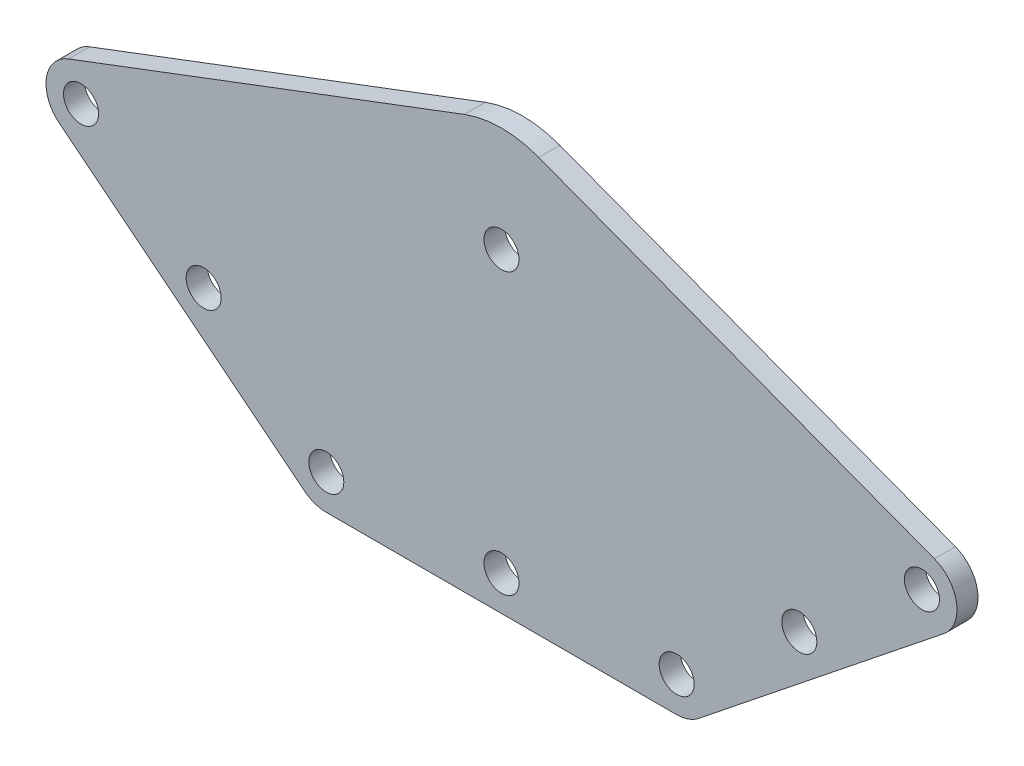
ISO-10303-21;
HEADER;
FILE_DESCRIPTION(('STEP AP214'),'2;1');
FILE_NAME('part.step','',(''),(''),'','','');
FILE_SCHEMA(('AUTOMOTIVE_DESIGN { 1 0 10303 214 1 1 1 1 }'));
ENDSEC;
DATA;
#1=APPLICATION_CONTEXT('core data for automotive mechanical design processes');
#2=APPLICATION_PROTOCOL_DEFINITION('international standard','automotive_design',2000,#1);
#3=PRODUCT_CONTEXT('',#1,'mechanical');
#4=PRODUCT('Part','Part','',(#3));
#5=PRODUCT_RELATED_PRODUCT_CATEGORY('part','',(#4));
#6=PRODUCT_DEFINITION_FORMATION('','',#4);
#7=PRODUCT_DEFINITION_CONTEXT('part definition',#1,'design');
#8=PRODUCT_DEFINITION('design','',#6,#7);
#9=PRODUCT_DEFINITION_SHAPE('','',#8);
#10=(LENGTH_UNIT() NAMED_UNIT(*) SI_UNIT(.MILLI.,.METRE.));
#11=(NAMED_UNIT(*) PLANE_ANGLE_UNIT() SI_UNIT($,.RADIAN.));
#12=(NAMED_UNIT(*) SI_UNIT($,.STERADIAN.) SOLID_ANGLE_UNIT());
#13=UNCERTAINTY_MEASURE_WITH_UNIT(LENGTH_MEASURE(1.E-05),#10,'distance_accuracy_value','');
#14=(GEOMETRIC_REPRESENTATION_CONTEXT(3) GLOBAL_UNCERTAINTY_ASSIGNED_CONTEXT((#13)) GLOBAL_UNIT_ASSIGNED_CONTEXT((#10,
#11,#12)) REPRESENTATION_CONTEXT('',''));
#15=CARTESIAN_POINT('',(0.,0.,0.));
#16=DIRECTION('',(0.,0.,1.));
#17=DIRECTION('',(1.,0.,0.));
#18=AXIS2_PLACEMENT_3D('',#15,#16,#17);
#19=CARTESIAN_POINT('',(-60.,27.9784594893,3.));
#20=DIRECTION('',(0.,0.,-1.));
#21=DIRECTION('',(-1.,0.,0.));
#22=AXIS2_PLACEMENT_3D('',#19,#20,#21);
#23=PLANE('',#22);
#24=CARTESIAN_POINT('',(-60.,27.9784594893,3.));
#25=DIRECTION('',(0.,0.,1.));
#26=DIRECTION('',(-1.,0.,0.));
#27=AXIS2_PLACEMENT_3D('',#24,#25,#26);
#28=CIRCLE('',#27,5.);
#29=CARTESIAN_POINT('',(-61.7702394037156,32.6545959772067,3.));
#30=VERTEX_POINT('',#29);
#31=CARTESIAN_POINT('',(-63.1220093937488,24.0729432180057,3.));
#32=VERTEX_POINT('',#31);
#33=EDGE_CURVE('E162',#30,#32,#28,.T.);
#34=ORIENTED_EDGE('',*,*,#33,.T.);
#35=DIRECTION('',(0.781103254258852,-0.624401878749762,0.));
#36=VECTOR('',#35,1.);
#37=CARTESIAN_POINT('',(-63.1220093937488,24.0729432180057,3.));
#38=LINE('',#37,#36);
#39=CARTESIAN_POINT('',(-28.1220093937488,-3.90551627129425,3.));
#40=VERTEX_POINT('',#39);
#41=EDGE_CURVE('E99',#32,#40,#38,.T.);
#42=ORIENTED_EDGE('',*,*,#41,.T.);
#43=CARTESIAN_POINT('',(-25.,0.,3.));
#44=DIRECTION('',(0.,0.,1.));
#45=DIRECTION('',(1.,0.,0.));
#46=AXIS2_PLACEMENT_3D('',#43,#44,#45);
#47=CIRCLE('',#46,5.00000000000001);
#48=CARTESIAN_POINT('',(-25.,-5.,3.));
#49=VERTEX_POINT('',#48);
#50=EDGE_CURVE('E183',#40,#49,#47,.T.);
#51=ORIENTED_EDGE('',*,*,#50,.T.);
#52=DIRECTION('',(1.,0.,0.));
#53=VECTOR('',#52,1.);
#54=CARTESIAN_POINT('',(0.,-5.,3.));
#55=LINE('',#54,#53);
#56=CARTESIAN_POINT('',(25.,-5.,3.));
#57=VERTEX_POINT('',#56);
#58=EDGE_CURVE('E201',#49,#57,#55,.T.);
#59=ORIENTED_EDGE('',*,*,#58,.T.);
#60=CARTESIAN_POINT('',(25.,0.,3.));
#61=DIRECTION('',(0.,0.,1.));
#62=DIRECTION('',(1.,0.,0.));
#63=AXIS2_PLACEMENT_3D('',#60,#61,#62);
#64=CIRCLE('',#63,5.00000000000001);
#65=CARTESIAN_POINT('',(28.1220093937488,-3.90551627129426,3.));
#66=VERTEX_POINT('',#65);
#67=EDGE_CURVE('E198',#57,#66,#64,.T.);
#68=ORIENTED_EDGE('',*,*,#67,.T.);
#69=DIRECTION('',(0.781103254258851,0.624401878749762,0.));
#70=VECTOR('',#69,1.);
#71=CARTESIAN_POINT('',(28.1220093937488,-3.90551627129426,3.));
#72=LINE('',#71,#70);
#73=CARTESIAN_POINT('',(63.1220093937488,24.0729432180057,3.));
#74=VERTEX_POINT('',#73);
#75=EDGE_CURVE('E200',#66,#74,#72,.T.);
#76=ORIENTED_EDGE('',*,*,#75,.T.);
#77=CARTESIAN_POINT('',(60.,27.9784594893,3.));
#78=DIRECTION('',(0.,0.,1.));
#79=DIRECTION('',(1.,0.,0.));
#80=AXIS2_PLACEMENT_3D('',#77,#78,#79);
#81=CIRCLE('',#80,5.);
#82=CARTESIAN_POINT('',(61.7702394037155,32.6545959772067,3.));
#83=VERTEX_POINT('',#82);
#84=EDGE_CURVE('E124',#74,#83,#81,.T.);
#85=ORIENTED_EDGE('',*,*,#84,.T.);
#86=DIRECTION('',(-0.935227297581348,0.354047880743111,0.));
#87=VECTOR('',#86,1.);
#88=CARTESIAN_POINT('',(5.31071821114667,54.0284094637202,3.));
#89=LINE('',#88,#87);
#90=CARTESIAN_POINT('',(5.31071821114667,54.0284094637202,3.));
#91=VERTEX_POINT('',#90);
#92=EDGE_CURVE('E118',#83,#91,#89,.T.);
#93=ORIENTED_EDGE('',*,*,#92,.T.);
#94=CARTESIAN_POINT('',(0.,40.,3.));
#95=DIRECTION('',(0.,0.,1.));
#96=DIRECTION('',(-1.,0.,0.));
#97=AXIS2_PLACEMENT_3D('',#94,#95,#96);
#98=CIRCLE('',#97,15.);
#99=CARTESIAN_POINT('',(-5.31071821114667,54.0284094637202,3.));
#100=VERTEX_POINT('',#99);
#101=EDGE_CURVE('E122',#91,#100,#98,.T.);
#102=ORIENTED_EDGE('',*,*,#101,.T.);
#103=DIRECTION('',(-0.935227297581348,-0.354047880743111,0.));
#104=VECTOR('',#103,1.);
#105=CARTESIAN_POINT('',(-61.7702394037156,32.6545959772067,3.));
#106=LINE('',#105,#104);
#107=EDGE_CURVE('E50',#100,#30,#106,.T.);
#108=ORIENTED_EDGE('',*,*,#107,.T.);
#109=EDGE_LOOP('',(#34,#42,#51,#59,#68,#76,#85,#93,#102,#108));
#110=FACE_BOUND('',#109,.T.);
#111=CARTESIAN_POINT('',(-60.,27.9784594893,3.));
#112=DIRECTION('',(0.,0.,1.));
#113=DIRECTION('',(1.,0.,0.));
#114=AXIS2_PLACEMENT_3D('',#111,#112,#113);
#115=CIRCLE('',#114,2.49999999999999);
#116=CARTESIAN_POINT('',(-57.5,27.9784594893,3.));
#117=VERTEX_POINT('',#116);
#118=EDGE_CURVE('E146',#117,#117,#115,.T.);
#119=ORIENTED_EDGE('',*,*,#118,.F.);
#120=EDGE_LOOP('',(#119));
#121=FACE_BOUND('',#120,.T.);
#122=CARTESIAN_POINT('',(0.,40.,3.));
#123=DIRECTION('',(0.,0.,1.));
#124=DIRECTION('',(1.,0.,0.));
#125=AXIS2_PLACEMENT_3D('',#122,#123,#124);
#126=CIRCLE('',#125,2.5);
#127=CARTESIAN_POINT('',(2.5,40.,3.));
#128=VERTEX_POINT('',#127);
#129=EDGE_CURVE('E212',#128,#128,#126,.T.);
#130=ORIENTED_EDGE('',*,*,#129,.F.);
#131=EDGE_LOOP('',(#130));
#132=FACE_BOUND('',#131,.T.);
#133=CARTESIAN_POINT('',(60.,27.9784594893,3.));
#134=DIRECTION('',(0.,0.,1.));
#135=DIRECTION('',(1.,0.,0.));
#136=AXIS2_PLACEMENT_3D('',#133,#134,#135);
#137=CIRCLE('',#136,2.50000000000002);
#138=CARTESIAN_POINT('',(62.5,27.9784594893,3.));
#139=VERTEX_POINT('',#138);
#140=EDGE_CURVE('E218',#139,#139,#137,.T.);
#141=ORIENTED_EDGE('',*,*,#140,.F.);
#142=EDGE_LOOP('',(#141));
#143=FACE_BOUND('',#142,.T.);
#144=CARTESIAN_POINT('',(25.,0.,3.));
#145=DIRECTION('',(0.,0.,1.));
#146=DIRECTION('',(1.,0.,0.));
#147=AXIS2_PLACEMENT_3D('',#144,#145,#146);
#148=CIRCLE('',#147,2.5);
#149=CARTESIAN_POINT('',(27.5,0.,3.));
#150=VERTEX_POINT('',#149);
#151=EDGE_CURVE('E224',#150,#150,#148,.T.);
#152=ORIENTED_EDGE('',*,*,#151,.F.);
#153=EDGE_LOOP('',(#152));
#154=FACE_BOUND('',#153,.T.);
#155=CARTESIAN_POINT('',(0.,0.,3.));
#156=DIRECTION('',(0.,0.,1.));
#157=DIRECTION('',(1.,0.,0.));
#158=AXIS2_PLACEMENT_3D('',#155,#156,#157);
#159=CIRCLE('',#158,2.5);
#160=CARTESIAN_POINT('',(2.5,0.,3.));
#161=VERTEX_POINT('',#160);
#162=EDGE_CURVE('E230',#161,#161,#159,.T.);
#163=ORIENTED_EDGE('',*,*,#162,.F.);
#164=EDGE_LOOP('',(#163));
#165=FACE_BOUND('',#164,.T.);
#166=CARTESIAN_POINT('',(-25.,0.,3.));
#167=DIRECTION('',(0.,0.,1.));
#168=DIRECTION('',(1.,0.,0.));
#169=AXIS2_PLACEMENT_3D('',#166,#167,#168);
#170=CIRCLE('',#169,2.5);
#171=CARTESIAN_POINT('',(-22.5,0.,3.));
#172=VERTEX_POINT('',#171);
#173=EDGE_CURVE('E236',#172,#172,#170,.T.);
#174=ORIENTED_EDGE('',*,*,#173,.F.);
#175=EDGE_LOOP('',(#174));
#176=FACE_BOUND('',#175,.T.);
#177=CARTESIAN_POINT('',(-42.5,13.98922974465,3.));
#178=DIRECTION('',(0.,0.,1.));
#179=DIRECTION('',(1.,0.,0.));
#180=AXIS2_PLACEMENT_3D('',#177,#178,#179);
#181=CIRCLE('',#180,2.5);
#182=CARTESIAN_POINT('',(-40.,13.98922974465,3.));
#183=VERTEX_POINT('',#182);
#184=EDGE_CURVE('E242',#183,#183,#181,.T.);
#185=ORIENTED_EDGE('',*,*,#184,.F.);
#186=EDGE_LOOP('',(#185));
#187=FACE_BOUND('',#186,.T.);
#188=CARTESIAN_POINT('',(42.5,13.98922974465,3.));
#189=DIRECTION('',(0.,0.,1.));
#190=DIRECTION('',(1.,0.,0.));
#191=AXIS2_PLACEMENT_3D('',#188,#189,#190);
#192=CIRCLE('',#191,2.5);
#193=CARTESIAN_POINT('',(45.,13.98922974465,3.));
#194=VERTEX_POINT('',#193);
#195=EDGE_CURVE('E248',#194,#194,#192,.T.);
#196=ORIENTED_EDGE('',*,*,#195,.F.);
#197=EDGE_LOOP('',(#196));
#198=FACE_BOUND('',#197,.T.);
#199=ADVANCED_FACE('F33',(#110,#121,#132,#143,#154,#165,#176,#187,#198),#23,.F.);
#200=CARTESIAN_POINT('',(-60.,27.9784594893,0.));
#201=DIRECTION('',(0.,0.,-1.));
#202=DIRECTION('',(-1.,0.,0.));
#203=AXIS2_PLACEMENT_3D('',#200,#201,#202);
#204=PLANE('',#203);
#205=CARTESIAN_POINT('',(-42.5,13.98922974465,0.));
#206=DIRECTION('',(0.,0.,1.));
#207=DIRECTION('',(1.,0.,0.));
#208=AXIS2_PLACEMENT_3D('',#205,#206,#207);
#209=CIRCLE('',#208,2.5);
#210=CARTESIAN_POINT('',(-40.,13.98922974465,0.));
#211=VERTEX_POINT('',#210);
#212=EDGE_CURVE('E245',#211,#211,#209,.T.);
#213=ORIENTED_EDGE('',*,*,#212,.T.);
#214=EDGE_LOOP('',(#213));
#215=FACE_BOUND('',#214,.T.);
#216=CARTESIAN_POINT('',(0.,0.,0.));
#217=DIRECTION('',(0.,0.,1.));
#218=DIRECTION('',(1.,0.,0.));
#219=AXIS2_PLACEMENT_3D('',#216,#217,#218);
#220=CIRCLE('',#219,2.5);
#221=CARTESIAN_POINT('',(2.5,0.,0.));
#222=VERTEX_POINT('',#221);
#223=EDGE_CURVE('E233',#222,#222,#220,.T.);
#224=ORIENTED_EDGE('',*,*,#223,.T.);
#225=EDGE_LOOP('',(#224));
#226=FACE_BOUND('',#225,.T.);
#227=CARTESIAN_POINT('',(60.,27.9784594893,0.));
#228=DIRECTION('',(0.,0.,1.));
#229=DIRECTION('',(1.,0.,0.));
#230=AXIS2_PLACEMENT_3D('',#227,#228,#229);
#231=CIRCLE('',#230,2.50000000000002);
#232=CARTESIAN_POINT('',(62.5,27.9784594893,0.));
#233=VERTEX_POINT('',#232);
#234=EDGE_CURVE('E221',#233,#233,#231,.T.);
#235=ORIENTED_EDGE('',*,*,#234,.T.);
#236=EDGE_LOOP('',(#235));
#237=FACE_BOUND('',#236,.T.);
#238=CARTESIAN_POINT('',(-60.,27.9784594893,0.));
#239=DIRECTION('',(0.,0.,1.));
#240=DIRECTION('',(1.,0.,0.));
#241=AXIS2_PLACEMENT_3D('',#238,#239,#240);
#242=CIRCLE('',#241,2.49999999999999);
#243=CARTESIAN_POINT('',(-57.5,27.9784594893,0.));
#244=VERTEX_POINT('',#243);
#245=EDGE_CURVE('E209',#244,#244,#242,.T.);
#246=ORIENTED_EDGE('',*,*,#245,.T.);
#247=EDGE_LOOP('',(#246));
#248=FACE_BOUND('',#247,.T.);
#249=CARTESIAN_POINT('',(-60.,27.9784594893,0.));
#250=DIRECTION('',(0.,0.,1.));
#251=DIRECTION('',(-1.,0.,0.));
#252=AXIS2_PLACEMENT_3D('',#249,#250,#251);
#253=CIRCLE('',#252,5.);
#254=CARTESIAN_POINT('',(-61.7702394037156,32.6545959772067,0.));
#255=VERTEX_POINT('',#254);
#256=CARTESIAN_POINT('',(-63.1220093937488,24.0729432180057,0.));
#257=VERTEX_POINT('',#256);
#258=EDGE_CURVE('E142',#255,#257,#253,.T.);
#259=ORIENTED_EDGE('',*,*,#258,.F.);
#260=DIRECTION('',(-0.935227297581348,-0.354047880743111,0.));
#261=VECTOR('',#260,1.);
#262=CARTESIAN_POINT('',(-61.7702394037156,32.6545959772067,0.));
#263=LINE('',#262,#261);
#264=CARTESIAN_POINT('',(-5.31071821114667,54.0284094637202,0.));
#265=VERTEX_POINT('',#264);
#266=EDGE_CURVE('E91',#265,#255,#263,.T.);
#267=ORIENTED_EDGE('',*,*,#266,.F.);
#268=CARTESIAN_POINT('',(0.,40.,0.));
#269=DIRECTION('',(0.,0.,1.));
#270=DIRECTION('',(-1.,0.,0.));
#271=AXIS2_PLACEMENT_3D('',#268,#269,#270);
#272=CIRCLE('',#271,15.);
#273=CARTESIAN_POINT('',(5.31071821114667,54.0284094637202,0.));
#274=VERTEX_POINT('',#273);
#275=EDGE_CURVE('E85',#274,#265,#272,.T.);
#276=ORIENTED_EDGE('',*,*,#275,.F.);
#277=DIRECTION('',(-0.935227297581348,0.354047880743111,0.));
#278=VECTOR('',#277,1.);
#279=CARTESIAN_POINT('',(5.31071821114667,54.0284094637202,0.));
#280=LINE('',#279,#278);
#281=CARTESIAN_POINT('',(61.7702394037155,32.6545959772067,0.));
#282=VERTEX_POINT('',#281);
#283=EDGE_CURVE('E132',#282,#274,#280,.T.);
#284=ORIENTED_EDGE('',*,*,#283,.F.);
#285=CARTESIAN_POINT('',(60.,27.9784594893,0.));
#286=DIRECTION('',(0.,0.,1.));
#287=DIRECTION('',(1.,0.,0.));
#288=AXIS2_PLACEMENT_3D('',#285,#286,#287);
#289=CIRCLE('',#288,5.);
#290=CARTESIAN_POINT('',(63.1220093937488,24.0729432180057,0.));
#291=VERTEX_POINT('',#290);
#292=EDGE_CURVE('E157',#291,#282,#289,.T.);
#293=ORIENTED_EDGE('',*,*,#292,.F.);
#294=DIRECTION('',(0.781103254258851,0.624401878749762,0.));
#295=VECTOR('',#294,1.);
#296=CARTESIAN_POINT('',(28.1220093937488,-3.90551627129426,0.));
#297=LINE('',#296,#295);
#298=CARTESIAN_POINT('',(28.1220093937488,-3.90551627129426,0.));
#299=VERTEX_POINT('',#298);
#300=EDGE_CURVE('E155',#299,#291,#297,.T.);
#301=ORIENTED_EDGE('',*,*,#300,.F.);
#302=CARTESIAN_POINT('',(25.,0.,0.));
#303=DIRECTION('',(0.,0.,1.));
#304=DIRECTION('',(1.,0.,0.));
#305=AXIS2_PLACEMENT_3D('',#302,#303,#304);
#306=CIRCLE('',#305,5.00000000000001);
#307=CARTESIAN_POINT('',(25.,-5.,0.));
#308=VERTEX_POINT('',#307);
#309=EDGE_CURVE('E153',#308,#299,#306,.T.);
#310=ORIENTED_EDGE('',*,*,#309,.F.);
#311=DIRECTION('',(1.,0.,0.));
#312=VECTOR('',#311,1.);
#313=CARTESIAN_POINT('',(0.,-5.,0.));
#314=LINE('',#313,#312);
#315=CARTESIAN_POINT('',(-25.,-5.,0.));
#316=VERTEX_POINT('',#315);
#317=EDGE_CURVE('E151',#316,#308,#314,.T.);
#318=ORIENTED_EDGE('',*,*,#317,.F.);
#319=CARTESIAN_POINT('',(-25.,0.,0.));
#320=DIRECTION('',(0.,0.,1.));
#321=DIRECTION('',(1.,0.,0.));
#322=AXIS2_PLACEMENT_3D('',#319,#320,#321);
#323=CIRCLE('',#322,5.00000000000001);
#324=CARTESIAN_POINT('',(-28.1220093937488,-3.90551627129425,0.));
#325=VERTEX_POINT('',#324);
#326=EDGE_CURVE('E148',#325,#316,#323,.T.);
#327=ORIENTED_EDGE('',*,*,#326,.F.);
#328=DIRECTION('',(0.781103254258852,-0.624401878749762,0.));
#329=VECTOR('',#328,1.);
#330=CARTESIAN_POINT('',(-63.1220093937488,24.0729432180057,0.));
#331=LINE('',#330,#329);
#332=EDGE_CURVE('E145',#257,#325,#331,.T.);
#333=ORIENTED_EDGE('',*,*,#332,.F.);
#334=EDGE_LOOP('',(#259,#267,#276,#284,#293,#301,#310,#318,#327,#333));
#335=FACE_BOUND('',#334,.T.);
#336=CARTESIAN_POINT('',(0.,40.,0.));
#337=DIRECTION('',(0.,0.,1.));
#338=DIRECTION('',(1.,0.,0.));
#339=AXIS2_PLACEMENT_3D('',#336,#337,#338);
#340=CIRCLE('',#339,2.5);
#341=CARTESIAN_POINT('',(2.5,40.,0.));
#342=VERTEX_POINT('',#341);
#343=EDGE_CURVE('E215',#342,#342,#340,.T.);
#344=ORIENTED_EDGE('',*,*,#343,.T.);
#345=EDGE_LOOP('',(#344));
#346=FACE_BOUND('',#345,.T.);
#347=CARTESIAN_POINT('',(25.,0.,0.));
#348=DIRECTION('',(0.,0.,1.));
#349=DIRECTION('',(1.,0.,0.));
#350=AXIS2_PLACEMENT_3D('',#347,#348,#349);
#351=CIRCLE('',#350,2.5);
#352=CARTESIAN_POINT('',(27.5,0.,0.));
#353=VERTEX_POINT('',#352);
#354=EDGE_CURVE('E227',#353,#353,#351,.T.);
#355=ORIENTED_EDGE('',*,*,#354,.T.);
#356=EDGE_LOOP('',(#355));
#357=FACE_BOUND('',#356,.T.);
#358=CARTESIAN_POINT('',(-25.,0.,0.));
#359=DIRECTION('',(0.,0.,1.));
#360=DIRECTION('',(1.,0.,0.));
#361=AXIS2_PLACEMENT_3D('',#358,#359,#360);
#362=CIRCLE('',#361,2.5);
#363=CARTESIAN_POINT('',(-22.5,0.,0.));
#364=VERTEX_POINT('',#363);
#365=EDGE_CURVE('E239',#364,#364,#362,.T.);
#366=ORIENTED_EDGE('',*,*,#365,.T.);
#367=EDGE_LOOP('',(#366));
#368=FACE_BOUND('',#367,.T.);
#369=CARTESIAN_POINT('',(42.5,13.98922974465,0.));
#370=DIRECTION('',(0.,0.,1.));
#371=DIRECTION('',(1.,0.,0.));
#372=AXIS2_PLACEMENT_3D('',#369,#370,#371);
#373=CIRCLE('',#372,2.5);
#374=CARTESIAN_POINT('',(45.,13.98922974465,0.));
#375=VERTEX_POINT('',#374);
#376=EDGE_CURVE('E251',#375,#375,#373,.T.);
#377=ORIENTED_EDGE('',*,*,#376,.T.);
#378=EDGE_LOOP('',(#377));
#379=FACE_BOUND('',#378,.T.);
#380=ADVANCED_FACE('F186',(#215,#226,#237,#248,#335,#346,#357,#368,#379),#204,.T.);
#381=CARTESIAN_POINT('',(-60.,27.9784594893,3.));
#382=DIRECTION('',(0.,0.,-1.));
#383=DIRECTION('',(-1.,0.,0.));
#384=AXIS2_PLACEMENT_3D('',#381,#382,#383);
#385=CYLINDRICAL_SURFACE('',#384,5.);
#386=ORIENTED_EDGE('',*,*,#258,.T.);
#387=DIRECTION('',(0.,0.,-1.));
#388=VECTOR('',#387,1.);
#389=CARTESIAN_POINT('',(-63.1220093937488,24.0729432180057,3.));
#390=LINE('',#389,#388);
#391=EDGE_CURVE('E11',#32,#257,#390,.T.);
#392=ORIENTED_EDGE('',*,*,#391,.F.);
#393=ORIENTED_EDGE('',*,*,#33,.F.);
#394=DIRECTION('',(0.,0.,-1.));
#395=VECTOR('',#394,1.);
#396=CARTESIAN_POINT('',(-61.7702394037156,32.6545959772067,3.));
#397=LINE('',#396,#395);
#398=EDGE_CURVE('E138',#30,#255,#397,.T.);
#399=ORIENTED_EDGE('',*,*,#398,.T.);
#400=EDGE_LOOP('',(#386,#392,#393,#399));
#401=FACE_BOUND('',#400,.T.);
#402=ADVANCED_FACE('F35',(#401),#385,.T.);
#403=CARTESIAN_POINT('',(-63.1220093937488,24.0729432180057,3.));
#404=DIRECTION('',(0.624401878749762,0.781103254258851,0.));
#405=DIRECTION('',(-0.781103254258851,0.624401878749762,0.));
#406=AXIS2_PLACEMENT_3D('',#403,#404,#405);
#407=PLANE('',#406);
#408=ORIENTED_EDGE('',*,*,#332,.T.);
#409=DIRECTION('',(0.,0.,-1.));
#410=VECTOR('',#409,1.);
#411=CARTESIAN_POINT('',(-28.1220093937488,-3.90551627129425,3.));
#412=LINE('',#411,#410);
#413=EDGE_CURVE('E42',#40,#325,#412,.T.);
#414=ORIENTED_EDGE('',*,*,#413,.F.);
#415=ORIENTED_EDGE('',*,*,#41,.F.);
#416=ORIENTED_EDGE('',*,*,#391,.T.);
#417=EDGE_LOOP('',(#408,#414,#415,#416));
#418=FACE_BOUND('',#417,.T.);
#419=ADVANCED_FACE('F291',(#418),#407,.F.);
#420=CARTESIAN_POINT('',(-25.,0.,3.));
#421=DIRECTION('',(0.,0.,-1.));
#422=DIRECTION('',(-1.,0.,0.));
#423=AXIS2_PLACEMENT_3D('',#420,#421,#422);
#424=CYLINDRICAL_SURFACE('',#423,5.00000000000001);
#425=ORIENTED_EDGE('',*,*,#326,.T.);
#426=DIRECTION('',(0.,0.,-1.));
#427=VECTOR('',#426,1.);
#428=CARTESIAN_POINT('',(-25.,-5.,3.));
#429=LINE('',#428,#427);
#430=EDGE_CURVE('E175',#49,#316,#429,.T.);
#431=ORIENTED_EDGE('',*,*,#430,.F.);
#432=ORIENTED_EDGE('',*,*,#50,.F.);
#433=ORIENTED_EDGE('',*,*,#413,.T.);
#434=EDGE_LOOP('',(#425,#431,#432,#433));
#435=FACE_BOUND('',#434,.T.);
#436=ADVANCED_FACE('F181',(#435),#424,.T.);
#437=CARTESIAN_POINT('',(0.,-5.,3.));
#438=DIRECTION('',(0.,1.,0.));
#439=DIRECTION('',(0.,0.,1.));
#440=AXIS2_PLACEMENT_3D('',#437,#438,#439);
#441=PLANE('',#440);
#442=ORIENTED_EDGE('',*,*,#317,.T.);
#443=DIRECTION('',(0.,0.,-1.));
#444=VECTOR('',#443,1.);
#445=CARTESIAN_POINT('',(25.,-5.,3.));
#446=LINE('',#445,#444);
#447=EDGE_CURVE('E172',#57,#308,#446,.T.);
#448=ORIENTED_EDGE('',*,*,#447,.F.);
#449=ORIENTED_EDGE('',*,*,#58,.F.);
#450=ORIENTED_EDGE('',*,*,#430,.T.);
#451=EDGE_LOOP('',(#442,#448,#449,#450));
#452=FACE_BOUND('',#451,.T.);
#453=ADVANCED_FACE('F192',(#452),#441,.F.);
#454=CARTESIAN_POINT('',(25.,0.,3.));
#455=DIRECTION('',(0.,0.,-1.));
#456=DIRECTION('',(-1.,0.,0.));
#457=AXIS2_PLACEMENT_3D('',#454,#455,#456);
#458=CYLINDRICAL_SURFACE('',#457,5.00000000000001);
#459=ORIENTED_EDGE('',*,*,#309,.T.);
#460=DIRECTION('',(0.,0.,-1.));
#461=VECTOR('',#460,1.);
#462=CARTESIAN_POINT('',(28.1220093937488,-3.90551627129426,3.));
#463=LINE('',#462,#461);
#464=EDGE_CURVE('E169',#66,#299,#463,.T.);
#465=ORIENTED_EDGE('',*,*,#464,.F.);
#466=ORIENTED_EDGE('',*,*,#67,.F.);
#467=ORIENTED_EDGE('',*,*,#447,.T.);
#468=EDGE_LOOP('',(#459,#465,#466,#467));
#469=FACE_BOUND('',#468,.T.);
#470=ADVANCED_FACE('F196',(#469),#458,.T.);
#471=CARTESIAN_POINT('',(28.1220093937488,-3.90551627129426,3.));
#472=DIRECTION('',(-0.624401878749762,0.781103254258851,0.));
#473=DIRECTION('',(-0.781103254258852,-0.624401878749762,0.));
#474=AXIS2_PLACEMENT_3D('',#471,#472,#473);
#475=PLANE('',#474);
#476=ORIENTED_EDGE('',*,*,#300,.T.);
#477=DIRECTION('',(0.,0.,-1.));
#478=VECTOR('',#477,1.);
#479=CARTESIAN_POINT('',(63.1220093937488,24.0729432180057,3.));
#480=LINE('',#479,#478);
#481=EDGE_CURVE('E166',#74,#291,#480,.T.);
#482=ORIENTED_EDGE('',*,*,#481,.F.);
#483=ORIENTED_EDGE('',*,*,#75,.F.);
#484=ORIENTED_EDGE('',*,*,#464,.T.);
#485=EDGE_LOOP('',(#476,#482,#483,#484));
#486=FACE_BOUND('',#485,.T.);
#487=ADVANCED_FACE('F281',(#486),#475,.F.);
#488=CARTESIAN_POINT('',(60.,27.9784594893,3.));
#489=DIRECTION('',(0.,0.,-1.));
#490=DIRECTION('',(-1.,0.,0.));
#491=AXIS2_PLACEMENT_3D('',#488,#489,#490);
#492=CYLINDRICAL_SURFACE('',#491,5.);
#493=ORIENTED_EDGE('',*,*,#292,.T.);
#494=DIRECTION('',(0.,0.,-1.));
#495=VECTOR('',#494,1.);
#496=CARTESIAN_POINT('',(61.7702394037155,32.6545959772067,3.));
#497=LINE('',#496,#495);
#498=EDGE_CURVE('E133',#83,#282,#497,.T.);
#499=ORIENTED_EDGE('',*,*,#498,.F.);
#500=ORIENTED_EDGE('',*,*,#84,.F.);
#501=ORIENTED_EDGE('',*,*,#481,.T.);
#502=EDGE_LOOP('',(#493,#499,#500,#501));
#503=FACE_BOUND('',#502,.T.);
#504=ADVANCED_FACE('F278',(#503),#492,.T.);
#505=CARTESIAN_POINT('',(5.31071821114667,54.0284094637202,3.));
#506=DIRECTION('',(-0.354047880743111,-0.935227297581348,0.));
#507=DIRECTION('',(0.935227297581348,-0.354047880743111,0.));
#508=AXIS2_PLACEMENT_3D('',#505,#506,#507);
#509=PLANE('',#508);
#510=ORIENTED_EDGE('',*,*,#283,.T.);
#511=DIRECTION('',(0.,0.,-1.));
#512=VECTOR('',#511,1.);
#513=CARTESIAN_POINT('',(5.31071821114667,54.0284094637202,3.));
#514=LINE('',#513,#512);
#515=EDGE_CURVE('E129',#91,#274,#514,.T.);
#516=ORIENTED_EDGE('',*,*,#515,.F.);
#517=ORIENTED_EDGE('',*,*,#92,.F.);
#518=ORIENTED_EDGE('',*,*,#498,.T.);
#519=EDGE_LOOP('',(#510,#516,#517,#518));
#520=FACE_BOUND('',#519,.T.);
#521=ADVANCED_FACE('F130',(#520),#509,.F.);
#522=CARTESIAN_POINT('',(0.,40.,3.));
#523=DIRECTION('',(0.,0.,-1.));
#524=DIRECTION('',(-1.,0.,0.));
#525=AXIS2_PLACEMENT_3D('',#522,#523,#524);
#526=CYLINDRICAL_SURFACE('',#525,15.);
#527=ORIENTED_EDGE('',*,*,#275,.T.);
#528=DIRECTION('',(0.,0.,-1.));
#529=VECTOR('',#528,1.);
#530=CARTESIAN_POINT('',(-5.31071821114667,54.0284094637202,3.));
#531=LINE('',#530,#529);
#532=EDGE_CURVE('E134',#100,#265,#531,.T.);
#533=ORIENTED_EDGE('',*,*,#532,.F.);
#534=ORIENTED_EDGE('',*,*,#101,.F.);
#535=ORIENTED_EDGE('',*,*,#515,.T.);
#536=EDGE_LOOP('',(#527,#533,#534,#535));
#537=FACE_BOUND('',#536,.T.);
#538=ADVANCED_FACE('F136',(#537),#526,.T.);
#539=CARTESIAN_POINT('',(-61.7702394037156,32.6545959772067,3.));
#540=DIRECTION('',(0.354047880743111,-0.935227297581348,0.));
#541=DIRECTION('',(0.935227297581348,0.354047880743111,0.));
#542=AXIS2_PLACEMENT_3D('',#539,#540,#541);
#543=PLANE('',#542);
#544=ORIENTED_EDGE('',*,*,#266,.T.);
#545=ORIENTED_EDGE('',*,*,#398,.F.);
#546=ORIENTED_EDGE('',*,*,#107,.F.);
#547=ORIENTED_EDGE('',*,*,#532,.T.);
#548=EDGE_LOOP('',(#544,#545,#546,#547));
#549=FACE_BOUND('',#548,.T.);
#550=ADVANCED_FACE('F271',(#549),#543,.F.);
#551=CARTESIAN_POINT('',(-60.,27.9784594893,3.));
#552=DIRECTION('',(0.,0.,-1.));
#553=DIRECTION('',(-1.,0.,0.));
#554=AXIS2_PLACEMENT_3D('',#551,#552,#553);
#555=CYLINDRICAL_SURFACE('',#554,2.49999999999999);
#556=ORIENTED_EDGE('',*,*,#118,.T.);
#557=EDGE_LOOP('',(#556));
#558=FACE_BOUND('',#557,.T.);
#559=ORIENTED_EDGE('',*,*,#245,.F.);
#560=EDGE_LOOP('',(#559));
#561=FACE_BOUND('',#560,.T.);
#562=ADVANCED_FACE('F268',(#558,#561),#555,.F.);
#563=CARTESIAN_POINT('',(0.,40.,3.));
#564=DIRECTION('',(0.,0.,-1.));
#565=DIRECTION('',(-1.,0.,0.));
#566=AXIS2_PLACEMENT_3D('',#563,#564,#565);
#567=CYLINDRICAL_SURFACE('',#566,2.5);
#568=ORIENTED_EDGE('',*,*,#129,.T.);
#569=EDGE_LOOP('',(#568));
#570=FACE_BOUND('',#569,.T.);
#571=ORIENTED_EDGE('',*,*,#343,.F.);
#572=EDGE_LOOP('',(#571));
#573=FACE_BOUND('',#572,.T.);
#574=ADVANCED_FACE('F370',(#570,#573),#567,.F.);
#575=CARTESIAN_POINT('',(60.,27.9784594893,3.));
#576=DIRECTION('',(0.,0.,-1.));
#577=DIRECTION('',(-1.,0.,0.));
#578=AXIS2_PLACEMENT_3D('',#575,#576,#577);
#579=CYLINDRICAL_SURFACE('',#578,2.50000000000002);
#580=ORIENTED_EDGE('',*,*,#140,.T.);
#581=EDGE_LOOP('',(#580));
#582=FACE_BOUND('',#581,.T.);
#583=ORIENTED_EDGE('',*,*,#234,.F.);
#584=EDGE_LOOP('',(#583));
#585=FACE_BOUND('',#584,.T.);
#586=ADVANCED_FACE('F378',(#582,#585),#579,.F.);
#587=CARTESIAN_POINT('',(25.,0.,3.));
#588=DIRECTION('',(0.,0.,-1.));
#589=DIRECTION('',(-1.,0.,0.));
#590=AXIS2_PLACEMENT_3D('',#587,#588,#589);
#591=CYLINDRICAL_SURFACE('',#590,2.5);
#592=ORIENTED_EDGE('',*,*,#151,.T.);
#593=EDGE_LOOP('',(#592));
#594=FACE_BOUND('',#593,.T.);
#595=ORIENTED_EDGE('',*,*,#354,.F.);
#596=EDGE_LOOP('',(#595));
#597=FACE_BOUND('',#596,.T.);
#598=ADVANCED_FACE('F386',(#594,#597),#591,.F.);
#599=CARTESIAN_POINT('',(0.,0.,3.));
#600=DIRECTION('',(0.,0.,-1.));
#601=DIRECTION('',(-1.,0.,0.));
#602=AXIS2_PLACEMENT_3D('',#599,#600,#601);
#603=CYLINDRICAL_SURFACE('',#602,2.5);
#604=ORIENTED_EDGE('',*,*,#162,.T.);
#605=EDGE_LOOP('',(#604));
#606=FACE_BOUND('',#605,.T.);
#607=ORIENTED_EDGE('',*,*,#223,.F.);
#608=EDGE_LOOP('',(#607));
#609=FACE_BOUND('',#608,.T.);
#610=ADVANCED_FACE('F395',(#606,#609),#603,.F.);
#611=CARTESIAN_POINT('',(-25.,0.,3.));
#612=DIRECTION('',(0.,0.,-1.));
#613=DIRECTION('',(-1.,0.,0.));
#614=AXIS2_PLACEMENT_3D('',#611,#612,#613);
#615=CYLINDRICAL_SURFACE('',#614,2.5);
#616=ORIENTED_EDGE('',*,*,#173,.T.);
#617=EDGE_LOOP('',(#616));
#618=FACE_BOUND('',#617,.T.);
#619=ORIENTED_EDGE('',*,*,#365,.F.);
#620=EDGE_LOOP('',(#619));
#621=FACE_BOUND('',#620,.T.);
#622=ADVANCED_FACE('F404',(#618,#621),#615,.F.);
#623=CARTESIAN_POINT('',(-42.5,13.98922974465,3.));
#624=DIRECTION('',(0.,0.,-1.));
#625=DIRECTION('',(-1.,0.,0.));
#626=AXIS2_PLACEMENT_3D('',#623,#624,#625);
#627=CYLINDRICAL_SURFACE('',#626,2.5);
#628=ORIENTED_EDGE('',*,*,#184,.T.);
#629=EDGE_LOOP('',(#628));
#630=FACE_BOUND('',#629,.T.);
#631=ORIENTED_EDGE('',*,*,#212,.F.);
#632=EDGE_LOOP('',(#631));
#633=FACE_BOUND('',#632,.T.);
#634=ADVANCED_FACE('F413',(#630,#633),#627,.F.);
#635=CARTESIAN_POINT('',(42.5,13.98922974465,3.));
#636=DIRECTION('',(0.,0.,-1.));
#637=DIRECTION('',(-1.,0.,0.));
#638=AXIS2_PLACEMENT_3D('',#635,#636,#637);
#639=CYLINDRICAL_SURFACE('',#638,2.5);
#640=ORIENTED_EDGE('',*,*,#195,.T.);
#641=EDGE_LOOP('',(#640));
#642=FACE_BOUND('',#641,.T.);
#643=ORIENTED_EDGE('',*,*,#376,.F.);
#644=EDGE_LOOP('',(#643));
#645=FACE_BOUND('',#644,.T.);
#646=ADVANCED_FACE('F257',(#642,#645),#639,.F.);
#647=CLOSED_SHELL('',(#199,#380,#402,#419,#436,#453,#470,#487,#504,#521,#538,#550,#562,#574,
#586,#598,#610,#622,#634,#646));
#648=MANIFOLD_SOLID_BREP('B2',#647);
#649=ADVANCED_BREP_SHAPE_REPRESENTATION('',(#18,#648),#14);
#650=SHAPE_DEFINITION_REPRESENTATION(#9,#649);
ENDSEC;
END-ISO-10303-21;
